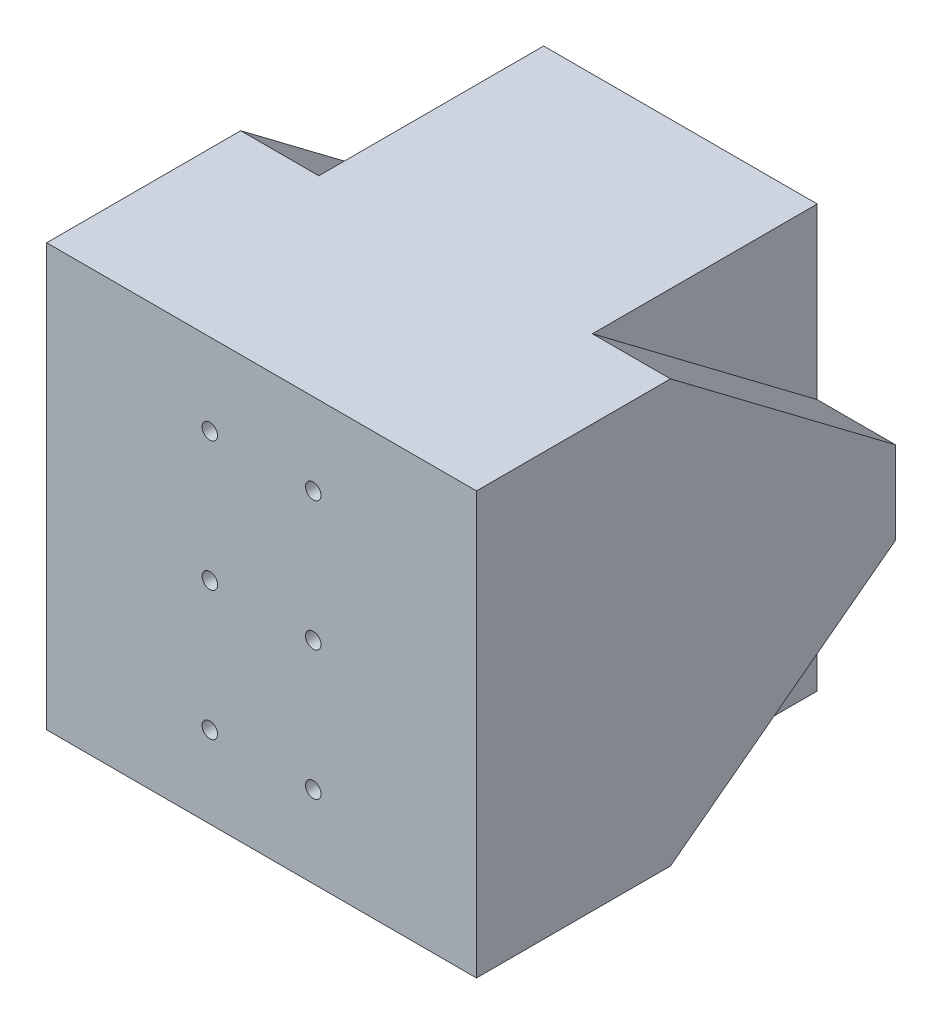
ISO-10303-21;
HEADER;
FILE_DESCRIPTION(('STEP AP214'),'2;1');
FILE_NAME('part.step','',(''),(''),'','','');
FILE_SCHEMA(('AUTOMOTIVE_DESIGN { 1 0 10303 214 1 1 1 1 }'));
ENDSEC;
DATA;
#1=APPLICATION_CONTEXT('core data for automotive mechanical design processes');
#2=APPLICATION_PROTOCOL_DEFINITION('international standard','automotive_design',2000,#1);
#3=PRODUCT_CONTEXT('',#1,'mechanical');
#4=PRODUCT('Part','Part','',(#3));
#5=PRODUCT_RELATED_PRODUCT_CATEGORY('part','',(#4));
#6=PRODUCT_DEFINITION_FORMATION('','',#4);
#7=PRODUCT_DEFINITION_CONTEXT('part definition',#1,'design');
#8=PRODUCT_DEFINITION('design','',#6,#7);
#9=PRODUCT_DEFINITION_SHAPE('','',#8);
#10=(LENGTH_UNIT() NAMED_UNIT(*) SI_UNIT(.MILLI.,.METRE.));
#11=(NAMED_UNIT(*) PLANE_ANGLE_UNIT() SI_UNIT($,.RADIAN.));
#12=(NAMED_UNIT(*) SI_UNIT($,.STERADIAN.) SOLID_ANGLE_UNIT());
#13=UNCERTAINTY_MEASURE_WITH_UNIT(LENGTH_MEASURE(1.E-05),#10,'distance_accuracy_value','');
#14=(GEOMETRIC_REPRESENTATION_CONTEXT(3) GLOBAL_UNCERTAINTY_ASSIGNED_CONTEXT((#13)) GLOBAL_UNIT_ASSIGNED_CONTEXT((#10,
#11,#12)) REPRESENTATION_CONTEXT('',''));
#15=CARTESIAN_POINT('',(0.,0.,0.));
#16=DIRECTION('',(0.,0.,1.));
#17=DIRECTION('',(1.,0.,0.));
#18=AXIS2_PLACEMENT_3D('',#15,#16,#17);
#19=CARTESIAN_POINT('',(26.45,-40.78,80.99));
#20=DIRECTION('',(-1.,0.,0.));
#21=DIRECTION('',(0.,0.,1.));
#22=AXIS2_PLACEMENT_3D('',#19,#20,#21);
#23=PLANE('',#22);
#24=DIRECTION('',(0.,0.,-1.));
#25=VECTOR('',#24,1.);
#26=CARTESIAN_POINT('',(26.45,40.78,80.99));
#27=LINE('',#26,#25);
#28=CARTESIAN_POINT('',(26.45,40.78,43.47));
#29=VERTEX_POINT('',#28);
#30=CARTESIAN_POINT('',(26.45,40.78,0.));
#31=VERTEX_POINT('',#30);
#32=EDGE_CURVE('E11',#29,#31,#27,.T.);
#33=ORIENTED_EDGE('',*,*,#32,.F.);
#34=DIRECTION('',(0.,-0.601850239386593,-0.798608971493748));
#35=VECTOR('',#34,1.);
#36=CARTESIAN_POINT('',(26.45,40.78,43.47));
#37=LINE('',#36,#35);
#38=CARTESIAN_POINT('',(26.45,8.02,0.));
#39=VERTEX_POINT('',#38);
#40=EDGE_CURVE('E172',#29,#39,#37,.T.);
#41=ORIENTED_EDGE('',*,*,#40,.T.);
#42=DIRECTION('',(0.,1.,0.));
#43=VECTOR('',#42,1.);
#44=CARTESIAN_POINT('',(26.45,-40.78,0.));
#45=LINE('',#44,#43);
#46=EDGE_CURVE('E253',#39,#31,#45,.T.);
#47=ORIENTED_EDGE('',*,*,#46,.T.);
#48=EDGE_LOOP('',(#33,#41,#47));
#49=FACE_BOUND('',#48,.T.);
#50=ADVANCED_FACE('F35',(#49),#23,.F.);
#51=CARTESIAN_POINT('',(-26.45,-40.78,80.99));
#52=DIRECTION('',(1.,0.,0.));
#53=DIRECTION('',(0.,0.,-1.));
#54=AXIS2_PLACEMENT_3D('',#51,#52,#53);
#55=PLANE('',#54);
#56=DIRECTION('',(0.,-0.601850239386593,0.798608971493748));
#57=VECTOR('',#56,1.);
#58=CARTESIAN_POINT('',(-26.45,-8.02,0.));
#59=LINE('',#58,#57);
#60=CARTESIAN_POINT('',(-26.45,-8.02,0.));
#61=VERTEX_POINT('',#60);
#62=CARTESIAN_POINT('',(-26.45,-40.78,43.47));
#63=VERTEX_POINT('',#62);
#64=EDGE_CURVE('E202',#61,#63,#59,.T.);
#65=ORIENTED_EDGE('',*,*,#64,.F.);
#66=DIRECTION('',(0.,-1.,0.));
#67=VECTOR('',#66,1.);
#68=CARTESIAN_POINT('',(-26.45,-40.78,0.));
#69=LINE('',#68,#67);
#70=CARTESIAN_POINT('',(-26.45,-40.78,0.));
#71=VERTEX_POINT('',#70);
#72=EDGE_CURVE('E268',#61,#71,#69,.T.);
#73=ORIENTED_EDGE('',*,*,#72,.T.);
#74=DIRECTION('',(0.,0.,-1.));
#75=VECTOR('',#74,1.);
#76=CARTESIAN_POINT('',(-26.45,-40.78,80.99));
#77=LINE('',#76,#75);
#78=EDGE_CURVE('E273',#63,#71,#77,.T.);
#79=ORIENTED_EDGE('',*,*,#78,.F.);
#80=EDGE_LOOP('',(#65,#73,#79));
#81=FACE_BOUND('',#80,.T.);
#82=ADVANCED_FACE('F311',(#81),#55,.F.);
#83=DIRECTION('',(0.,-0.601850239386593,-0.798608971493748));
#84=VECTOR('',#83,1.);
#85=CARTESIAN_POINT('',(-26.45,40.78,43.47));
#86=LINE('',#85,#84);
#87=CARTESIAN_POINT('',(-26.45,40.78,43.47));
#88=VERTEX_POINT('',#87);
#89=CARTESIAN_POINT('',(-26.45,8.02,0.));
#90=VERTEX_POINT('',#89);
#91=EDGE_CURVE('E60',#88,#90,#86,.T.);
#92=ORIENTED_EDGE('',*,*,#91,.F.);
#93=DIRECTION('',(0.,0.,-1.));
#94=VECTOR('',#93,1.);
#95=CARTESIAN_POINT('',(-26.45,40.78,80.99));
#96=LINE('',#95,#94);
#97=CARTESIAN_POINT('',(-26.45,40.78,0.));
#98=VERTEX_POINT('',#97);
#99=EDGE_CURVE('E44',#88,#98,#96,.T.);
#100=ORIENTED_EDGE('',*,*,#99,.T.);
#101=EDGE_CURVE('E269',#98,#90,#69,.T.);
#102=ORIENTED_EDGE('',*,*,#101,.T.);
#103=EDGE_LOOP('',(#92,#100,#102));
#104=FACE_BOUND('',#103,.T.);
#105=ADVANCED_FACE('F316',(#104),#55,.F.);
#106=CARTESIAN_POINT('',(26.45,-40.78,0.));
#107=VERTEX_POINT('',#106);
#108=CARTESIAN_POINT('',(26.45,-8.02,0.));
#109=VERTEX_POINT('',#108);
#110=EDGE_CURVE('E262',#107,#109,#45,.T.);
#111=ORIENTED_EDGE('',*,*,#110,.T.);
#112=DIRECTION('',(0.,-0.601850239386593,0.798608971493748));
#113=VECTOR('',#112,1.);
#114=CARTESIAN_POINT('',(26.45,-8.02,0.));
#115=LINE('',#114,#113);
#116=CARTESIAN_POINT('',(26.45,-40.78,43.47));
#117=VERTEX_POINT('',#116);
#118=EDGE_CURVE('E190',#109,#117,#115,.T.);
#119=ORIENTED_EDGE('',*,*,#118,.T.);
#120=DIRECTION('',(0.,0.,-1.));
#121=VECTOR('',#120,1.);
#122=CARTESIAN_POINT('',(26.45,-40.78,80.99));
#123=LINE('',#122,#121);
#124=EDGE_CURVE('E161',#117,#107,#123,.T.);
#125=ORIENTED_EDGE('',*,*,#124,.T.);
#126=EDGE_LOOP('',(#111,#119,#125));
#127=FACE_BOUND('',#126,.T.);
#128=ADVANCED_FACE('F37',(#127),#23,.F.);
#129=CARTESIAN_POINT('',(-26.45,40.78,80.99));
#130=DIRECTION('',(0.,-1.,0.));
#131=DIRECTION('',(0.,0.,-1.));
#132=AXIS2_PLACEMENT_3D('',#129,#130,#131);
#133=PLANE('',#132);
#134=DIRECTION('',(-1.,0.,0.));
#135=VECTOR('',#134,1.);
#136=CARTESIAN_POINT('',(-26.45,40.78,0.));
#137=LINE('',#136,#135);
#138=EDGE_CURVE('E265',#31,#98,#137,.T.);
#139=ORIENTED_EDGE('',*,*,#138,.T.);
#140=ORIENTED_EDGE('',*,*,#99,.F.);
#141=DIRECTION('',(1.,0.,0.));
#142=VECTOR('',#141,1.);
#143=CARTESIAN_POINT('',(-41.55,40.78,43.47));
#144=LINE('',#143,#142);
#145=CARTESIAN_POINT('',(-41.55,40.78,43.47));
#146=VERTEX_POINT('',#145);
#147=EDGE_CURVE('E224',#146,#88,#144,.T.);
#148=ORIENTED_EDGE('',*,*,#147,.F.);
#149=DIRECTION('',(0.,0.,-1.));
#150=VECTOR('',#149,1.);
#151=CARTESIAN_POINT('',(-41.55,40.78,80.99));
#152=LINE('',#151,#150);
#153=CARTESIAN_POINT('',(-41.55,40.78,80.99));
#154=VERTEX_POINT('',#153);
#155=EDGE_CURVE('E201',#154,#146,#152,.T.);
#156=ORIENTED_EDGE('',*,*,#155,.F.);
#157=DIRECTION('',(-1.,0.,0.));
#158=VECTOR('',#157,1.);
#159=CARTESIAN_POINT('',(-26.45,40.78,80.99));
#160=LINE('',#159,#158);
#161=CARTESIAN_POINT('',(41.55,40.78,80.99));
#162=VERTEX_POINT('',#161);
#163=EDGE_CURVE('E162',#162,#154,#160,.T.);
#164=ORIENTED_EDGE('',*,*,#163,.F.);
#165=DIRECTION('',(0.,0.,-1.));
#166=VECTOR('',#165,1.);
#167=CARTESIAN_POINT('',(41.55,40.78,80.99));
#168=LINE('',#167,#166);
#169=CARTESIAN_POINT('',(41.55,40.78,43.47));
#170=VERTEX_POINT('',#169);
#171=EDGE_CURVE('E171',#162,#170,#168,.T.);
#172=ORIENTED_EDGE('',*,*,#171,.T.);
#173=DIRECTION('',(-1.,0.,0.));
#174=VECTOR('',#173,1.);
#175=CARTESIAN_POINT('',(41.55,40.78,43.47));
#176=LINE('',#175,#174);
#177=EDGE_CURVE('E189',#170,#29,#176,.T.);
#178=ORIENTED_EDGE('',*,*,#177,.T.);
#179=ORIENTED_EDGE('',*,*,#32,.T.);
#180=EDGE_LOOP('',(#139,#140,#148,#156,#164,#172,#178,#179));
#181=FACE_BOUND('',#180,.T.);
#182=ADVANCED_FACE('F321',(#181),#133,.F.);
#183=CARTESIAN_POINT('',(-26.45,-40.78,80.99));
#184=DIRECTION('',(0.,1.,0.));
#185=DIRECTION('',(0.,0.,1.));
#186=AXIS2_PLACEMENT_3D('',#183,#184,#185);
#187=PLANE('',#186);
#188=DIRECTION('',(1.,0.,0.));
#189=VECTOR('',#188,1.);
#190=CARTESIAN_POINT('',(-26.45,-40.78,0.));
#191=LINE('',#190,#189);
#192=EDGE_CURVE('E260',#71,#107,#191,.T.);
#193=ORIENTED_EDGE('',*,*,#192,.T.);
#194=ORIENTED_EDGE('',*,*,#124,.F.);
#195=DIRECTION('',(-1.,0.,0.));
#196=VECTOR('',#195,1.);
#197=CARTESIAN_POINT('',(41.55,-40.78,43.47));
#198=LINE('',#197,#196);
#199=CARTESIAN_POINT('',(41.55,-40.78,43.47));
#200=VERTEX_POINT('',#199);
#201=EDGE_CURVE('E52',#200,#117,#198,.T.);
#202=ORIENTED_EDGE('',*,*,#201,.F.);
#203=DIRECTION('',(0.,0.,1.));
#204=VECTOR('',#203,1.);
#205=CARTESIAN_POINT('',(41.55,-40.78,43.47));
#206=LINE('',#205,#204);
#207=CARTESIAN_POINT('',(41.55,-40.78,80.99));
#208=VERTEX_POINT('',#207);
#209=EDGE_CURVE('E168',#200,#208,#206,.T.);
#210=ORIENTED_EDGE('',*,*,#209,.T.);
#211=DIRECTION('',(1.,0.,0.));
#212=VECTOR('',#211,1.);
#213=CARTESIAN_POINT('',(-26.45,-40.78,80.99));
#214=LINE('',#213,#212);
#215=CARTESIAN_POINT('',(-41.55,-40.78,80.99));
#216=VERTEX_POINT('',#215);
#217=EDGE_CURVE('E150',#216,#208,#214,.T.);
#218=ORIENTED_EDGE('',*,*,#217,.F.);
#219=DIRECTION('',(0.,0.,1.));
#220=VECTOR('',#219,1.);
#221=CARTESIAN_POINT('',(-41.55,-40.78,43.47));
#222=LINE('',#221,#220);
#223=CARTESIAN_POINT('',(-41.55,-40.78,43.47));
#224=VERTEX_POINT('',#223);
#225=EDGE_CURVE('E210',#224,#216,#222,.T.);
#226=ORIENTED_EDGE('',*,*,#225,.F.);
#227=DIRECTION('',(1.,0.,0.));
#228=VECTOR('',#227,1.);
#229=CARTESIAN_POINT('',(-41.55,-40.78,43.47));
#230=LINE('',#229,#228);
#231=EDGE_CURVE('E212',#224,#63,#230,.T.);
#232=ORIENTED_EDGE('',*,*,#231,.T.);
#233=ORIENTED_EDGE('',*,*,#78,.T.);
#234=EDGE_LOOP('',(#193,#194,#202,#210,#218,#226,#232,#233));
#235=FACE_BOUND('',#234,.T.);
#236=ADVANCED_FACE('F175',(#235),#187,.F.);
#237=CARTESIAN_POINT('',(0.,0.,80.99));
#238=DIRECTION('',(0.,0.,-1.));
#239=DIRECTION('',(-1.,0.,0.));
#240=AXIS2_PLACEMENT_3D('',#237,#238,#239);
#241=PLANE('',#240);
#242=CARTESIAN_POINT('',(10.,0.,80.99));
#243=DIRECTION('',(0.,0.,1.));
#244=DIRECTION('',(1.,0.,0.));
#245=AXIS2_PLACEMENT_3D('',#242,#243,#244);
#246=CIRCLE('',#245,1.5);
#247=CARTESIAN_POINT('',(11.5,0.,80.99));
#248=VERTEX_POINT('',#247);
#249=EDGE_CURVE('E576',#248,#248,#246,.T.);
#250=ORIENTED_EDGE('',*,*,#249,.F.);
#251=EDGE_LOOP('',(#250));
#252=FACE_BOUND('',#251,.T.);
#253=CARTESIAN_POINT('',(-10.,-25.,80.99));
#254=DIRECTION('',(0.,0.,1.));
#255=DIRECTION('',(1.,0.,0.));
#256=AXIS2_PLACEMENT_3D('',#253,#254,#255);
#257=CIRCLE('',#256,1.5);
#258=CARTESIAN_POINT('',(-8.49999999999999,-25.,80.99));
#259=VERTEX_POINT('',#258);
#260=EDGE_CURVE('E571',#259,#259,#257,.T.);
#261=ORIENTED_EDGE('',*,*,#260,.F.);
#262=EDGE_LOOP('',(#261));
#263=FACE_BOUND('',#262,.T.);
#264=CARTESIAN_POINT('',(10.,25.,80.99));
#265=DIRECTION('',(0.,0.,1.));
#266=DIRECTION('',(1.,0.,0.));
#267=AXIS2_PLACEMENT_3D('',#264,#265,#266);
#268=CIRCLE('',#267,1.5);
#269=CARTESIAN_POINT('',(11.5,25.,80.99));
#270=VERTEX_POINT('',#269);
#271=EDGE_CURVE('E548',#270,#270,#268,.T.);
#272=ORIENTED_EDGE('',*,*,#271,.F.);
#273=EDGE_LOOP('',(#272));
#274=FACE_BOUND('',#273,.T.);
#275=CARTESIAN_POINT('',(-10.,0.,80.99));
#276=DIRECTION('',(0.,0.,1.));
#277=DIRECTION('',(1.,0.,0.));
#278=AXIS2_PLACEMENT_3D('',#275,#276,#277);
#279=CIRCLE('',#278,1.5);
#280=CARTESIAN_POINT('',(-8.5,0.,80.99));
#281=VERTEX_POINT('',#280);
#282=EDGE_CURVE('E570',#281,#281,#279,.T.);
#283=ORIENTED_EDGE('',*,*,#282,.F.);
#284=EDGE_LOOP('',(#283));
#285=FACE_BOUND('',#284,.T.);
#286=CARTESIAN_POINT('',(10.,-25.,80.99));
#287=DIRECTION('',(0.,0.,1.));
#288=DIRECTION('',(1.,0.,0.));
#289=AXIS2_PLACEMENT_3D('',#286,#287,#288);
#290=CIRCLE('',#289,1.5);
#291=CARTESIAN_POINT('',(11.5,-25.,80.99));
#292=VERTEX_POINT('',#291);
#293=EDGE_CURVE('E582',#292,#292,#290,.T.);
#294=ORIENTED_EDGE('',*,*,#293,.F.);
#295=EDGE_LOOP('',(#294));
#296=FACE_BOUND('',#295,.T.);
#297=CARTESIAN_POINT('',(-10.,25.,80.99));
#298=DIRECTION('',(0.,0.,1.));
#299=DIRECTION('',(1.,0.,0.));
#300=AXIS2_PLACEMENT_3D('',#297,#298,#299);
#301=CIRCLE('',#300,1.5);
#302=CARTESIAN_POINT('',(-8.49999999999999,25.,80.99));
#303=VERTEX_POINT('',#302);
#304=EDGE_CURVE('E280',#303,#303,#301,.T.);
#305=ORIENTED_EDGE('',*,*,#304,.F.);
#306=EDGE_LOOP('',(#305));
#307=FACE_BOUND('',#306,.T.);
#308=ORIENTED_EDGE('',*,*,#217,.T.);
#309=DIRECTION('',(0.,1.,0.));
#310=VECTOR('',#309,1.);
#311=CARTESIAN_POINT('',(41.55,-40.78,80.99));
#312=LINE('',#311,#310);
#313=EDGE_CURVE('E153',#208,#162,#312,.T.);
#314=ORIENTED_EDGE('',*,*,#313,.T.);
#315=ORIENTED_EDGE('',*,*,#163,.T.);
#316=DIRECTION('',(0.,1.,0.));
#317=VECTOR('',#316,1.);
#318=CARTESIAN_POINT('',(-41.55,-40.78,80.99));
#319=LINE('',#318,#317);
#320=EDGE_CURVE('E156',#216,#154,#319,.T.);
#321=ORIENTED_EDGE('',*,*,#320,.F.);
#322=EDGE_LOOP('',(#308,#314,#315,#321));
#323=FACE_BOUND('',#322,.T.);
#324=ADVANCED_FACE('F152',(#252,#263,#274,#285,#296,#307,#323),#241,.F.);
#325=CARTESIAN_POINT('',(0.,0.,0.));
#326=DIRECTION('',(0.,0.,-1.));
#327=DIRECTION('',(-1.,0.,0.));
#328=AXIS2_PLACEMENT_3D('',#325,#326,#327);
#329=PLANE('',#328);
#330=DIRECTION('',(0.,1.,0.));
#331=VECTOR('',#330,1.);
#332=CARTESIAN_POINT('',(-16.45,-30.78,0.));
#333=LINE('',#332,#331);
#334=CARTESIAN_POINT('',(-16.45,-30.78,0.));
#335=VERTEX_POINT('',#334);
#336=CARTESIAN_POINT('',(-16.45,30.78,0.));
#337=VERTEX_POINT('',#336);
#338=EDGE_CURVE('E227',#335,#337,#333,.T.);
#339=ORIENTED_EDGE('',*,*,#338,.F.);
#340=DIRECTION('',(-1.,0.,0.));
#341=VECTOR('',#340,1.);
#342=CARTESIAN_POINT('',(16.45,-30.78,0.));
#343=LINE('',#342,#341);
#344=CARTESIAN_POINT('',(16.45,-30.78,0.));
#345=VERTEX_POINT('',#344);
#346=EDGE_CURVE('E232',#345,#335,#343,.T.);
#347=ORIENTED_EDGE('',*,*,#346,.F.);
#348=DIRECTION('',(0.,-1.,0.));
#349=VECTOR('',#348,1.);
#350=CARTESIAN_POINT('',(16.45,-30.78,0.));
#351=LINE('',#350,#349);
#352=CARTESIAN_POINT('',(16.45,30.78,0.));
#353=VERTEX_POINT('',#352);
#354=EDGE_CURVE('E246',#353,#345,#351,.T.);
#355=ORIENTED_EDGE('',*,*,#354,.F.);
#356=DIRECTION('',(1.,0.,0.));
#357=VECTOR('',#356,1.);
#358=CARTESIAN_POINT('',(16.45,30.78,0.));
#359=LINE('',#358,#357);
#360=EDGE_CURVE('E243',#337,#353,#359,.T.);
#361=ORIENTED_EDGE('',*,*,#360,.F.);
#362=EDGE_LOOP('',(#339,#347,#355,#361));
#363=FACE_BOUND('',#362,.T.);
#364=ORIENTED_EDGE('',*,*,#110,.F.);
#365=ORIENTED_EDGE('',*,*,#192,.F.);
#366=ORIENTED_EDGE('',*,*,#72,.F.);
#367=DIRECTION('',(1.,0.,0.));
#368=VECTOR('',#367,1.);
#369=CARTESIAN_POINT('',(-41.55,-8.02,0.));
#370=LINE('',#369,#368);
#371=CARTESIAN_POINT('',(-41.55,-8.02,0.));
#372=VERTEX_POINT('',#371);
#373=EDGE_CURVE('E218',#372,#61,#370,.T.);
#374=ORIENTED_EDGE('',*,*,#373,.F.);
#375=DIRECTION('',(0.,-1.,0.));
#376=VECTOR('',#375,1.);
#377=CARTESIAN_POINT('',(-41.55,8.02,0.));
#378=LINE('',#377,#376);
#379=CARTESIAN_POINT('',(-41.55,8.02,0.));
#380=VERTEX_POINT('',#379);
#381=EDGE_CURVE('E206',#380,#372,#378,.T.);
#382=ORIENTED_EDGE('',*,*,#381,.F.);
#383=DIRECTION('',(1.,0.,0.));
#384=VECTOR('',#383,1.);
#385=CARTESIAN_POINT('',(-41.55,8.02,0.));
#386=LINE('',#385,#384);
#387=EDGE_CURVE('E221',#380,#90,#386,.T.);
#388=ORIENTED_EDGE('',*,*,#387,.T.);
#389=ORIENTED_EDGE('',*,*,#101,.F.);
#390=ORIENTED_EDGE('',*,*,#138,.F.);
#391=ORIENTED_EDGE('',*,*,#46,.F.);
#392=DIRECTION('',(-1.,0.,0.));
#393=VECTOR('',#392,1.);
#394=CARTESIAN_POINT('',(41.55,8.02,0.));
#395=LINE('',#394,#393);
#396=CARTESIAN_POINT('',(41.55,8.02,0.));
#397=VERTEX_POINT('',#396);
#398=EDGE_CURVE('E195',#397,#39,#395,.T.);
#399=ORIENTED_EDGE('',*,*,#398,.F.);
#400=DIRECTION('',(0.,-1.,0.));
#401=VECTOR('',#400,1.);
#402=CARTESIAN_POINT('',(41.55,8.02,0.));
#403=LINE('',#402,#401);
#404=CARTESIAN_POINT('',(41.55,-8.02,0.));
#405=VERTEX_POINT('',#404);
#406=EDGE_CURVE('E179',#397,#405,#403,.T.);
#407=ORIENTED_EDGE('',*,*,#406,.T.);
#408=DIRECTION('',(-1.,0.,0.));
#409=VECTOR('',#408,1.);
#410=CARTESIAN_POINT('',(41.55,-8.02,0.));
#411=LINE('',#410,#409);
#412=EDGE_CURVE('E197',#405,#109,#411,.T.);
#413=ORIENTED_EDGE('',*,*,#412,.T.);
#414=EDGE_LOOP('',(#364,#365,#366,#374,#382,#388,#389,#390,#391,#399,#407,#413));
#415=FACE_BOUND('',#414,.T.);
#416=ADVANCED_FACE('F331',(#363,#415),#329,.T.);
#417=CARTESIAN_POINT('',(-16.45,-30.78,75.99));
#418=DIRECTION('',(-1.,0.,0.));
#419=DIRECTION('',(0.,0.,1.));
#420=AXIS2_PLACEMENT_3D('',#417,#418,#419);
#421=PLANE('',#420);
#422=ORIENTED_EDGE('',*,*,#338,.T.);
#423=DIRECTION('',(0.,0.,-1.));
#424=VECTOR('',#423,1.);
#425=CARTESIAN_POINT('',(-16.45,30.78,75.99));
#426=LINE('',#425,#424);
#427=CARTESIAN_POINT('',(-16.45,30.78,75.99));
#428=VERTEX_POINT('',#427);
#429=EDGE_CURVE('E241',#428,#337,#426,.T.);
#430=ORIENTED_EDGE('',*,*,#429,.F.);
#431=DIRECTION('',(0.,1.,0.));
#432=VECTOR('',#431,1.);
#433=CARTESIAN_POINT('',(-16.45,-30.78,75.99));
#434=LINE('',#433,#432);
#435=CARTESIAN_POINT('',(-16.45,-30.78,75.99));
#436=VERTEX_POINT('',#435);
#437=EDGE_CURVE('E228',#436,#428,#434,.T.);
#438=ORIENTED_EDGE('',*,*,#437,.F.);
#439=DIRECTION('',(0.,0.,-1.));
#440=VECTOR('',#439,1.);
#441=CARTESIAN_POINT('',(-16.45,-30.78,75.99));
#442=LINE('',#441,#440);
#443=EDGE_CURVE('E251',#436,#335,#442,.T.);
#444=ORIENTED_EDGE('',*,*,#443,.T.);
#445=EDGE_LOOP('',(#422,#430,#438,#444));
#446=FACE_BOUND('',#445,.T.);
#447=ADVANCED_FACE('F364',(#446),#421,.F.);
#448=CARTESIAN_POINT('',(16.45,-30.78,75.99));
#449=DIRECTION('',(0.,-1.,0.));
#450=DIRECTION('',(0.,0.,-1.));
#451=AXIS2_PLACEMENT_3D('',#448,#449,#450);
#452=PLANE('',#451);
#453=ORIENTED_EDGE('',*,*,#346,.T.);
#454=ORIENTED_EDGE('',*,*,#443,.F.);
#455=DIRECTION('',(-1.,0.,0.));
#456=VECTOR('',#455,1.);
#457=CARTESIAN_POINT('',(16.45,-30.78,75.99));
#458=LINE('',#457,#456);
#459=CARTESIAN_POINT('',(16.45,-30.78,75.99));
#460=VERTEX_POINT('',#459);
#461=EDGE_CURVE('E238',#460,#436,#458,.T.);
#462=ORIENTED_EDGE('',*,*,#461,.F.);
#463=DIRECTION('',(0.,0.,-1.));
#464=VECTOR('',#463,1.);
#465=CARTESIAN_POINT('',(16.45,-30.78,75.99));
#466=LINE('',#465,#464);
#467=EDGE_CURVE('E254',#460,#345,#466,.T.);
#468=ORIENTED_EDGE('',*,*,#467,.T.);
#469=EDGE_LOOP('',(#453,#454,#462,#468));
#470=FACE_BOUND('',#469,.T.);
#471=ADVANCED_FACE('F360',(#470),#452,.F.);
#472=CARTESIAN_POINT('',(16.45,-30.78,75.99));
#473=DIRECTION('',(1.,0.,0.));
#474=DIRECTION('',(0.,0.,-1.));
#475=AXIS2_PLACEMENT_3D('',#472,#473,#474);
#476=PLANE('',#475);
#477=ORIENTED_EDGE('',*,*,#354,.T.);
#478=ORIENTED_EDGE('',*,*,#467,.F.);
#479=DIRECTION('',(0.,-1.,0.));
#480=VECTOR('',#479,1.);
#481=CARTESIAN_POINT('',(16.45,-30.78,75.99));
#482=LINE('',#481,#480);
#483=CARTESIAN_POINT('',(16.45,30.78,75.99));
#484=VERTEX_POINT('',#483);
#485=EDGE_CURVE('E235',#484,#460,#482,.T.);
#486=ORIENTED_EDGE('',*,*,#485,.F.);
#487=DIRECTION('',(0.,0.,-1.));
#488=VECTOR('',#487,1.);
#489=CARTESIAN_POINT('',(16.45,30.78,75.99));
#490=LINE('',#489,#488);
#491=EDGE_CURVE('E256',#484,#353,#490,.T.);
#492=ORIENTED_EDGE('',*,*,#491,.T.);
#493=EDGE_LOOP('',(#477,#478,#486,#492));
#494=FACE_BOUND('',#493,.T.);
#495=ADVANCED_FACE('F363',(#494),#476,.F.);
#496=CARTESIAN_POINT('',(16.45,30.78,75.99));
#497=DIRECTION('',(0.,1.,0.));
#498=DIRECTION('',(0.,0.,1.));
#499=AXIS2_PLACEMENT_3D('',#496,#497,#498);
#500=PLANE('',#499);
#501=ORIENTED_EDGE('',*,*,#360,.T.);
#502=ORIENTED_EDGE('',*,*,#491,.F.);
#503=DIRECTION('',(1.,0.,0.));
#504=VECTOR('',#503,1.);
#505=CARTESIAN_POINT('',(16.45,30.78,75.99));
#506=LINE('',#505,#504);
#507=EDGE_CURVE('E231',#428,#484,#506,.T.);
#508=ORIENTED_EDGE('',*,*,#507,.F.);
#509=ORIENTED_EDGE('',*,*,#429,.T.);
#510=EDGE_LOOP('',(#501,#502,#508,#509));
#511=FACE_BOUND('',#510,.T.);
#512=ADVANCED_FACE('F359',(#511),#500,.F.);
#513=CARTESIAN_POINT('',(0.,0.,75.99));
#514=DIRECTION('',(0.,0.,1.));
#515=DIRECTION('',(1.,0.,0.));
#516=AXIS2_PLACEMENT_3D('',#513,#514,#515);
#517=PLANE('',#516);
#518=CARTESIAN_POINT('',(10.,0.,75.99));
#519=DIRECTION('',(0.,0.,1.));
#520=DIRECTION('',(1.,0.,0.));
#521=AXIS2_PLACEMENT_3D('',#518,#519,#520);
#522=CIRCLE('',#521,1.5);
#523=CARTESIAN_POINT('',(11.5,0.,75.99));
#524=VERTEX_POINT('',#523);
#525=EDGE_CURVE('E39',#524,#524,#522,.T.);
#526=ORIENTED_EDGE('',*,*,#525,.T.);
#527=EDGE_LOOP('',(#526));
#528=FACE_BOUND('',#527,.T.);
#529=CARTESIAN_POINT('',(-10.,-25.,75.99));
#530=DIRECTION('',(0.,0.,1.));
#531=DIRECTION('',(1.,0.,0.));
#532=AXIS2_PLACEMENT_3D('',#529,#530,#531);
#533=CIRCLE('',#532,1.5);
#534=CARTESIAN_POINT('',(-8.49999999999999,-25.,75.99));
#535=VERTEX_POINT('',#534);
#536=EDGE_CURVE('E288',#535,#535,#533,.T.);
#537=ORIENTED_EDGE('',*,*,#536,.T.);
#538=EDGE_LOOP('',(#537));
#539=FACE_BOUND('',#538,.T.);
#540=CARTESIAN_POINT('',(10.,25.,75.99));
#541=DIRECTION('',(0.,0.,1.));
#542=DIRECTION('',(1.,0.,0.));
#543=AXIS2_PLACEMENT_3D('',#540,#541,#542);
#544=CIRCLE('',#543,1.5);
#545=CARTESIAN_POINT('',(11.5,25.,75.99));
#546=VERTEX_POINT('',#545);
#547=EDGE_CURVE('E286',#546,#546,#544,.T.);
#548=ORIENTED_EDGE('',*,*,#547,.T.);
#549=EDGE_LOOP('',(#548));
#550=FACE_BOUND('',#549,.T.);
#551=CARTESIAN_POINT('',(-10.,0.,75.99));
#552=DIRECTION('',(0.,0.,1.));
#553=DIRECTION('',(1.,0.,0.));
#554=AXIS2_PLACEMENT_3D('',#551,#552,#553);
#555=CIRCLE('',#554,1.5);
#556=CARTESIAN_POINT('',(-8.5,0.,75.99));
#557=VERTEX_POINT('',#556);
#558=EDGE_CURVE('E283',#557,#557,#555,.T.);
#559=ORIENTED_EDGE('',*,*,#558,.T.);
#560=EDGE_LOOP('',(#559));
#561=FACE_BOUND('',#560,.T.);
#562=CARTESIAN_POINT('',(10.,-25.,75.99));
#563=DIRECTION('',(0.,0.,1.));
#564=DIRECTION('',(1.,0.,0.));
#565=AXIS2_PLACEMENT_3D('',#562,#563,#564);
#566=CIRCLE('',#565,1.5);
#567=CARTESIAN_POINT('',(11.5,-25.,75.99));
#568=VERTEX_POINT('',#567);
#569=EDGE_CURVE('E279',#568,#568,#566,.T.);
#570=ORIENTED_EDGE('',*,*,#569,.T.);
#571=EDGE_LOOP('',(#570));
#572=FACE_BOUND('',#571,.T.);
#573=CARTESIAN_POINT('',(-10.,25.,75.99));
#574=DIRECTION('',(0.,0.,1.));
#575=DIRECTION('',(1.,0.,0.));
#576=AXIS2_PLACEMENT_3D('',#573,#574,#575);
#577=CIRCLE('',#576,1.5);
#578=CARTESIAN_POINT('',(-8.49999999999999,25.,75.99));
#579=VERTEX_POINT('',#578);
#580=EDGE_CURVE('E276',#579,#579,#577,.T.);
#581=ORIENTED_EDGE('',*,*,#580,.T.);
#582=EDGE_LOOP('',(#581));
#583=FACE_BOUND('',#582,.T.);
#584=ORIENTED_EDGE('',*,*,#437,.T.);
#585=ORIENTED_EDGE('',*,*,#507,.T.);
#586=ORIENTED_EDGE('',*,*,#485,.T.);
#587=ORIENTED_EDGE('',*,*,#461,.T.);
#588=EDGE_LOOP('',(#584,#585,#586,#587));
#589=FACE_BOUND('',#588,.T.);
#590=ADVANCED_FACE('F295',(#528,#539,#550,#561,#572,#583,#589),#517,.F.);
#591=CARTESIAN_POINT('',(-41.55,40.78,43.47));
#592=DIRECTION('',(0.,-0.798608971493748,0.601850239386593));
#593=DIRECTION('',(0.,-0.601850239386593,-0.798608971493748));
#594=AXIS2_PLACEMENT_3D('',#591,#592,#593);
#595=PLANE('',#594);
#596=ORIENTED_EDGE('',*,*,#91,.T.);
#597=ORIENTED_EDGE('',*,*,#387,.F.);
#598=DIRECTION('',(0.,-0.601850239386593,-0.798608971493748));
#599=VECTOR('',#598,1.);
#600=CARTESIAN_POINT('',(-41.55,40.78,43.47));
#601=LINE('',#600,#599);
#602=EDGE_CURVE('E204',#146,#380,#601,.T.);
#603=ORIENTED_EDGE('',*,*,#602,.F.);
#604=ORIENTED_EDGE('',*,*,#147,.T.);
#605=EDGE_LOOP('',(#596,#597,#603,#604));
#606=FACE_BOUND('',#605,.T.);
#607=ADVANCED_FACE('F352',(#606),#595,.F.);
#608=CARTESIAN_POINT('',(-41.55,-8.02,0.));
#609=DIRECTION('',(0.,0.798608971493748,0.601850239386593));
#610=DIRECTION('',(0.,-0.601850239386593,0.798608971493748));
#611=AXIS2_PLACEMENT_3D('',#608,#609,#610);
#612=PLANE('',#611);
#613=ORIENTED_EDGE('',*,*,#64,.T.);
#614=ORIENTED_EDGE('',*,*,#231,.F.);
#615=DIRECTION('',(0.,-0.601850239386593,0.798608971493748));
#616=VECTOR('',#615,1.);
#617=CARTESIAN_POINT('',(-41.55,-8.02,0.));
#618=LINE('',#617,#616);
#619=EDGE_CURVE('E208',#372,#224,#618,.T.);
#620=ORIENTED_EDGE('',*,*,#619,.F.);
#621=ORIENTED_EDGE('',*,*,#373,.T.);
#622=EDGE_LOOP('',(#613,#614,#620,#621));
#623=FACE_BOUND('',#622,.T.);
#624=ADVANCED_FACE('F345',(#623),#612,.F.);
#625=CARTESIAN_POINT('',(-41.55,0.,0.));
#626=DIRECTION('',(-1.,0.,0.));
#627=DIRECTION('',(0.,0.,1.));
#628=AXIS2_PLACEMENT_3D('',#625,#626,#627);
#629=PLANE('',#628);
#630=ORIENTED_EDGE('',*,*,#320,.T.);
#631=ORIENTED_EDGE('',*,*,#155,.T.);
#632=ORIENTED_EDGE('',*,*,#602,.T.);
#633=ORIENTED_EDGE('',*,*,#381,.T.);
#634=ORIENTED_EDGE('',*,*,#619,.T.);
#635=ORIENTED_EDGE('',*,*,#225,.T.);
#636=EDGE_LOOP('',(#630,#631,#632,#633,#634,#635));
#637=FACE_BOUND('',#636,.T.);
#638=ADVANCED_FACE('F337',(#637),#629,.T.);
#639=CARTESIAN_POINT('',(41.55,-8.02,0.));
#640=DIRECTION('',(0.,-0.798608971493748,-0.601850239386593));
#641=DIRECTION('',(0.,0.601850239386593,-0.798608971493748));
#642=AXIS2_PLACEMENT_3D('',#639,#640,#641);
#643=PLANE('',#642);
#644=ORIENTED_EDGE('',*,*,#118,.F.);
#645=ORIENTED_EDGE('',*,*,#412,.F.);
#646=DIRECTION('',(0.,-0.601850239386593,0.798608971493748));
#647=VECTOR('',#646,1.);
#648=CARTESIAN_POINT('',(41.55,-8.02,0.));
#649=LINE('',#648,#647);
#650=EDGE_CURVE('E177',#405,#200,#649,.T.);
#651=ORIENTED_EDGE('',*,*,#650,.T.);
#652=ORIENTED_EDGE('',*,*,#201,.T.);
#653=EDGE_LOOP('',(#644,#645,#651,#652));
#654=FACE_BOUND('',#653,.T.);
#655=ADVANCED_FACE('F334',(#654),#643,.T.);
#656=CARTESIAN_POINT('',(41.55,40.78,43.47));
#657=DIRECTION('',(0.,0.798608971493748,-0.601850239386593));
#658=DIRECTION('',(0.,0.601850239386593,0.798608971493748));
#659=AXIS2_PLACEMENT_3D('',#656,#657,#658);
#660=PLANE('',#659);
#661=ORIENTED_EDGE('',*,*,#40,.F.);
#662=ORIENTED_EDGE('',*,*,#177,.F.);
#663=DIRECTION('',(0.,-0.601850239386593,-0.798608971493748));
#664=VECTOR('',#663,1.);
#665=CARTESIAN_POINT('',(41.55,40.78,43.47));
#666=LINE('',#665,#664);
#667=EDGE_CURVE('E185',#170,#397,#666,.T.);
#668=ORIENTED_EDGE('',*,*,#667,.T.);
#669=ORIENTED_EDGE('',*,*,#398,.T.);
#670=EDGE_LOOP('',(#661,#662,#668,#669));
#671=FACE_BOUND('',#670,.T.);
#672=ADVANCED_FACE('F336',(#671),#660,.T.);
#673=CARTESIAN_POINT('',(41.55,0.,0.));
#674=DIRECTION('',(1.,0.,0.));
#675=DIRECTION('',(0.,0.,1.));
#676=AXIS2_PLACEMENT_3D('',#673,#674,#675);
#677=PLANE('',#676);
#678=ORIENTED_EDGE('',*,*,#313,.F.);
#679=ORIENTED_EDGE('',*,*,#209,.F.);
#680=ORIENTED_EDGE('',*,*,#650,.F.);
#681=ORIENTED_EDGE('',*,*,#406,.F.);
#682=ORIENTED_EDGE('',*,*,#667,.F.);
#683=ORIENTED_EDGE('',*,*,#171,.F.);
#684=EDGE_LOOP('',(#678,#679,#680,#681,#682,#683));
#685=FACE_BOUND('',#684,.T.);
#686=ADVANCED_FACE('F166',(#685),#677,.T.);
#687=CARTESIAN_POINT('',(-10.,25.,0.));
#688=DIRECTION('',(0.,0.,1.));
#689=DIRECTION('',(1.,0.,0.));
#690=AXIS2_PLACEMENT_3D('',#687,#688,#689);
#691=CYLINDRICAL_SURFACE('',#690,1.5);
#692=ORIENTED_EDGE('',*,*,#304,.T.);
#693=EDGE_LOOP('',(#692));
#694=FACE_BOUND('',#693,.T.);
#695=ORIENTED_EDGE('',*,*,#580,.F.);
#696=EDGE_LOOP('',(#695));
#697=FACE_BOUND('',#696,.T.);
#698=ADVANCED_FACE('F496',(#694,#697),#691,.F.);
#699=CARTESIAN_POINT('',(10.,-25.,0.));
#700=DIRECTION('',(0.,0.,1.));
#701=DIRECTION('',(1.,0.,0.));
#702=AXIS2_PLACEMENT_3D('',#699,#700,#701);
#703=CYLINDRICAL_SURFACE('',#702,1.5);
#704=ORIENTED_EDGE('',*,*,#293,.T.);
#705=EDGE_LOOP('',(#704));
#706=FACE_BOUND('',#705,.T.);
#707=ORIENTED_EDGE('',*,*,#569,.F.);
#708=EDGE_LOOP('',(#707));
#709=FACE_BOUND('',#708,.T.);
#710=ADVANCED_FACE('F502',(#706,#709),#703,.F.);
#711=CARTESIAN_POINT('',(-10.,0.,0.));
#712=DIRECTION('',(0.,0.,1.));
#713=DIRECTION('',(1.,0.,0.));
#714=AXIS2_PLACEMENT_3D('',#711,#712,#713);
#715=CYLINDRICAL_SURFACE('',#714,1.5);
#716=ORIENTED_EDGE('',*,*,#282,.T.);
#717=EDGE_LOOP('',(#716));
#718=FACE_BOUND('',#717,.T.);
#719=ORIENTED_EDGE('',*,*,#558,.F.);
#720=EDGE_LOOP('',(#719));
#721=FACE_BOUND('',#720,.T.);
#722=ADVANCED_FACE('F511',(#718,#721),#715,.F.);
#723=CARTESIAN_POINT('',(10.,25.,0.));
#724=DIRECTION('',(0.,0.,1.));
#725=DIRECTION('',(1.,0.,0.));
#726=AXIS2_PLACEMENT_3D('',#723,#724,#725);
#727=CYLINDRICAL_SURFACE('',#726,1.5);
#728=ORIENTED_EDGE('',*,*,#271,.T.);
#729=EDGE_LOOP('',(#728));
#730=FACE_BOUND('',#729,.T.);
#731=ORIENTED_EDGE('',*,*,#547,.F.);
#732=EDGE_LOOP('',(#731));
#733=FACE_BOUND('',#732,.T.);
#734=ADVANCED_FACE('F305',(#730,#733),#727,.F.);
#735=CARTESIAN_POINT('',(-10.,-25.,0.));
#736=DIRECTION('',(0.,0.,1.));
#737=DIRECTION('',(1.,0.,0.));
#738=AXIS2_PLACEMENT_3D('',#735,#736,#737);
#739=CYLINDRICAL_SURFACE('',#738,1.5);
#740=ORIENTED_EDGE('',*,*,#260,.T.);
#741=EDGE_LOOP('',(#740));
#742=FACE_BOUND('',#741,.T.);
#743=ORIENTED_EDGE('',*,*,#536,.F.);
#744=EDGE_LOOP('',(#743));
#745=FACE_BOUND('',#744,.T.);
#746=ADVANCED_FACE('F299',(#742,#745),#739,.F.);
#747=CARTESIAN_POINT('',(10.,0.,0.));
#748=DIRECTION('',(0.,0.,1.));
#749=DIRECTION('',(1.,0.,0.));
#750=AXIS2_PLACEMENT_3D('',#747,#748,#749);
#751=CYLINDRICAL_SURFACE('',#750,1.5);
#752=ORIENTED_EDGE('',*,*,#249,.T.);
#753=EDGE_LOOP('',(#752));
#754=FACE_BOUND('',#753,.T.);
#755=ORIENTED_EDGE('',*,*,#525,.F.);
#756=EDGE_LOOP('',(#755));
#757=FACE_BOUND('',#756,.T.);
#758=ADVANCED_FACE('F297',(#754,#757),#751,.F.);
#759=CLOSED_SHELL('',(#50,#82,#105,#128,#182,#236,#324,#416,#447,#471,#495,#512,#590,#607,#624,
#638,#655,#672,#686,#698,#710,#722,#734,#746,#758));
#760=MANIFOLD_SOLID_BREP('B2',#759);
#761=ADVANCED_BREP_SHAPE_REPRESENTATION('',(#18,#760),#14);
#762=SHAPE_DEFINITION_REPRESENTATION(#9,#761);
ENDSEC;
END-ISO-10303-21;
